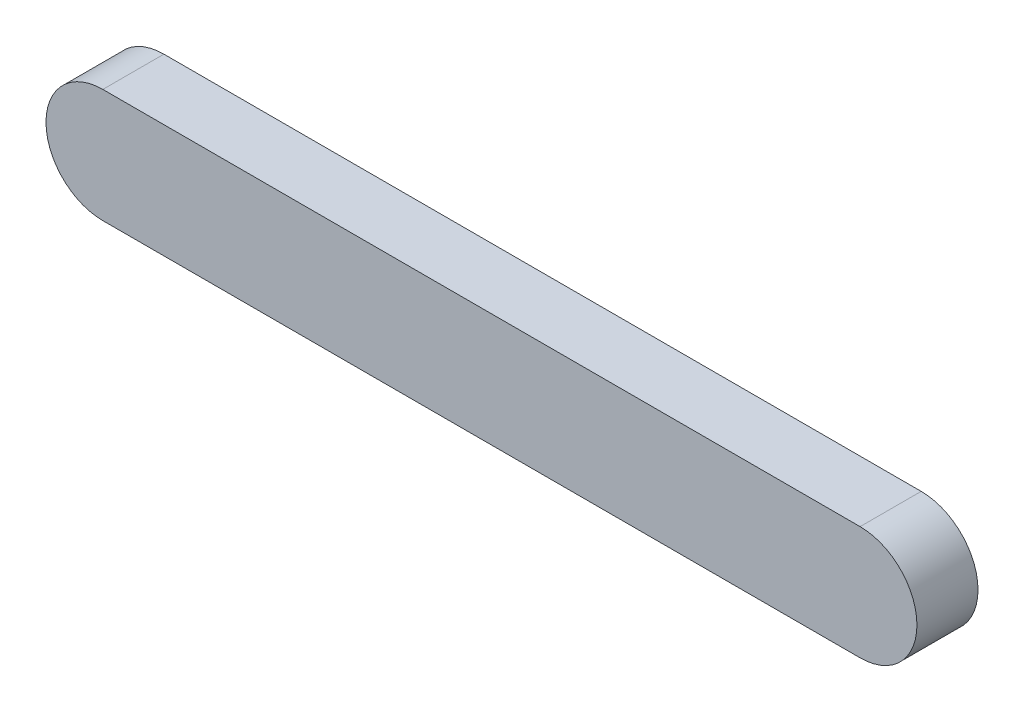
ISO-10303-21;
HEADER;
FILE_DESCRIPTION(('STEP AP214'),'2;1');
FILE_NAME('part.step','',(''),(''),'','','');
FILE_SCHEMA(('AUTOMOTIVE_DESIGN { 1 0 10303 214 1 1 1 1 }'));
ENDSEC;
DATA;
#1=APPLICATION_CONTEXT('core data for automotive mechanical design processes');
#2=APPLICATION_PROTOCOL_DEFINITION('international standard','automotive_design',2000,#1);
#3=PRODUCT_CONTEXT('',#1,'mechanical');
#4=PRODUCT('Part','Part','',(#3));
#5=PRODUCT_RELATED_PRODUCT_CATEGORY('part','',(#4));
#6=PRODUCT_DEFINITION_FORMATION('','',#4);
#7=PRODUCT_DEFINITION_CONTEXT('part definition',#1,'design');
#8=PRODUCT_DEFINITION('design','',#6,#7);
#9=PRODUCT_DEFINITION_SHAPE('','',#8);
#10=(LENGTH_UNIT() NAMED_UNIT(*) SI_UNIT(.MILLI.,.METRE.));
#11=(NAMED_UNIT(*) PLANE_ANGLE_UNIT() SI_UNIT($,.RADIAN.));
#12=(NAMED_UNIT(*) SI_UNIT($,.STERADIAN.) SOLID_ANGLE_UNIT());
#13=UNCERTAINTY_MEASURE_WITH_UNIT(LENGTH_MEASURE(1.E-05),#10,'distance_accuracy_value','');
#14=(GEOMETRIC_REPRESENTATION_CONTEXT(3) GLOBAL_UNCERTAINTY_ASSIGNED_CONTEXT((#13)) GLOBAL_UNIT_ASSIGNED_CONTEXT((#10,
#11,#12)) REPRESENTATION_CONTEXT('',''));
#15=CARTESIAN_POINT('',(0.,0.,0.));
#16=DIRECTION('',(0.,0.,1.));
#17=DIRECTION('',(1.,0.,0.));
#18=AXIS2_PLACEMENT_3D('',#15,#16,#17);
#19=CARTESIAN_POINT('',(69.4660631607421,0.,10.));
#20=DIRECTION('',(0.,0.,-1.));
#21=DIRECTION('',(-1.,0.,0.));
#22=AXIS2_PLACEMENT_3D('',#19,#20,#21);
#23=CYLINDRICAL_SURFACE('',#22,9.30539398447655);
#24=CARTESIAN_POINT('',(69.4660631607421,0.,0.));
#25=DIRECTION('',(0.,0.,1.));
#26=DIRECTION('',(1.,0.,0.));
#27=AXIS2_PLACEMENT_3D('',#24,#25,#26);
#28=CIRCLE('',#27,9.30539398447655);
#29=CARTESIAN_POINT('',(69.4660631607421,-9.30539398447656,0.));
#30=VERTEX_POINT('',#29);
#31=CARTESIAN_POINT('',(69.4660631607421,9.30539398447655,0.));
#32=VERTEX_POINT('',#31);
#33=EDGE_CURVE('E107',#30,#32,#28,.T.);
#34=ORIENTED_EDGE('',*,*,#33,.T.);
#35=DIRECTION('',(0.,0.,-1.));
#36=VECTOR('',#35,1.);
#37=CARTESIAN_POINT('',(69.4660631607421,9.30539398447655,10.));
#38=LINE('',#37,#36);
#39=CARTESIAN_POINT('',(69.4660631607421,9.30539398447655,10.));
#40=VERTEX_POINT('',#39);
#41=EDGE_CURVE('E11',#40,#32,#38,.T.);
#42=ORIENTED_EDGE('',*,*,#41,.F.);
#43=CARTESIAN_POINT('',(69.4660631607421,0.,10.));
#44=DIRECTION('',(0.,0.,1.));
#45=DIRECTION('',(1.,0.,0.));
#46=AXIS2_PLACEMENT_3D('',#43,#44,#45);
#47=CIRCLE('',#46,9.30539398447655);
#48=CARTESIAN_POINT('',(69.4660631607421,-9.30539398447656,10.));
#49=VERTEX_POINT('',#48);
#50=EDGE_CURVE('E91',#49,#40,#47,.T.);
#51=ORIENTED_EDGE('',*,*,#50,.F.);
#52=DIRECTION('',(0.,0.,-1.));
#53=VECTOR('',#52,1.);
#54=CARTESIAN_POINT('',(69.4660631607421,-9.30539398447656,10.));
#55=LINE('',#54,#53);
#56=EDGE_CURVE('E103',#49,#30,#55,.T.);
#57=ORIENTED_EDGE('',*,*,#56,.T.);
#58=EDGE_LOOP('',(#34,#42,#51,#57));
#59=FACE_BOUND('',#58,.T.);
#60=ADVANCED_FACE('F39',(#59),#23,.T.);
#61=CARTESIAN_POINT('',(69.4660631607421,9.30539398447655,10.));
#62=DIRECTION('',(0.,-1.,0.));
#63=DIRECTION('',(1.,0.,0.));
#64=AXIS2_PLACEMENT_3D('',#61,#62,#63);
#65=PLANE('',#64);
#66=DIRECTION('',(-1.,0.,0.));
#67=VECTOR('',#66,1.);
#68=CARTESIAN_POINT('',(69.4660631607421,9.30539398447655,0.));
#69=LINE('',#68,#67);
#70=CARTESIAN_POINT('',(-54.5339368392579,9.30539398447655,0.));
#71=VERTEX_POINT('',#70);
#72=EDGE_CURVE('E96',#32,#71,#69,.T.);
#73=ORIENTED_EDGE('',*,*,#72,.T.);
#74=DIRECTION('',(0.,0.,-1.));
#75=VECTOR('',#74,1.);
#76=CARTESIAN_POINT('',(-54.5339368392579,9.30539398447655,10.));
#77=LINE('',#76,#75);
#78=CARTESIAN_POINT('',(-54.5339368392579,9.30539398447655,10.));
#79=VERTEX_POINT('',#78);
#80=EDGE_CURVE('E48',#79,#71,#77,.T.);
#81=ORIENTED_EDGE('',*,*,#80,.F.);
#82=DIRECTION('',(-1.,0.,0.));
#83=VECTOR('',#82,1.);
#84=CARTESIAN_POINT('',(69.4660631607421,9.30539398447655,10.));
#85=LINE('',#84,#83);
#86=EDGE_CURVE('E86',#40,#79,#85,.T.);
#87=ORIENTED_EDGE('',*,*,#86,.F.);
#88=ORIENTED_EDGE('',*,*,#41,.T.);
#89=EDGE_LOOP('',(#73,#81,#87,#88));
#90=FACE_BOUND('',#89,.T.);
#91=ADVANCED_FACE('F95',(#90),#65,.F.);
#92=CARTESIAN_POINT('',(-54.5339368392579,0.,10.));
#93=DIRECTION('',(0.,0.,-1.));
#94=DIRECTION('',(-1.,0.,0.));
#95=AXIS2_PLACEMENT_3D('',#92,#93,#94);
#96=CYLINDRICAL_SURFACE('',#95,9.30539398447655);
#97=CARTESIAN_POINT('',(-54.5339368392579,0.,0.));
#98=DIRECTION('',(0.,0.,1.));
#99=DIRECTION('',(1.,0.,0.));
#100=AXIS2_PLACEMENT_3D('',#97,#98,#99);
#101=CIRCLE('',#100,9.30539398447655);
#102=CARTESIAN_POINT('',(-54.5339368392579,-9.30539398447655,0.));
#103=VERTEX_POINT('',#102);
#104=EDGE_CURVE('E73',#71,#103,#101,.T.);
#105=ORIENTED_EDGE('',*,*,#104,.T.);
#106=DIRECTION('',(0.,0.,-1.));
#107=VECTOR('',#106,1.);
#108=CARTESIAN_POINT('',(-54.5339368392579,-9.30539398447655,10.));
#109=LINE('',#108,#107);
#110=CARTESIAN_POINT('',(-54.5339368392579,-9.30539398447655,10.));
#111=VERTEX_POINT('',#110);
#112=EDGE_CURVE('E98',#111,#103,#109,.T.);
#113=ORIENTED_EDGE('',*,*,#112,.F.);
#114=CARTESIAN_POINT('',(-54.5339368392579,0.,10.));
#115=DIRECTION('',(0.,0.,1.));
#116=DIRECTION('',(1.,0.,0.));
#117=AXIS2_PLACEMENT_3D('',#114,#115,#116);
#118=CIRCLE('',#117,9.30539398447655);
#119=EDGE_CURVE('E89',#79,#111,#118,.T.);
#120=ORIENTED_EDGE('',*,*,#119,.F.);
#121=ORIENTED_EDGE('',*,*,#80,.T.);
#122=EDGE_LOOP('',(#105,#113,#120,#121));
#123=FACE_BOUND('',#122,.T.);
#124=ADVANCED_FACE('F99',(#123),#96,.T.);
#125=CARTESIAN_POINT('',(69.4660631607421,-9.30539398447656,10.));
#126=DIRECTION('',(0.,1.,0.));
#127=DIRECTION('',(-1.,0.,0.));
#128=AXIS2_PLACEMENT_3D('',#125,#126,#127);
#129=PLANE('',#128);
#130=DIRECTION('',(1.,0.,0.));
#131=VECTOR('',#130,1.);
#132=CARTESIAN_POINT('',(69.4660631607421,-9.30539398447656,0.));
#133=LINE('',#132,#131);
#134=EDGE_CURVE('E79',#103,#30,#133,.T.);
#135=ORIENTED_EDGE('',*,*,#134,.T.);
#136=ORIENTED_EDGE('',*,*,#56,.F.);
#137=DIRECTION('',(1.,0.,0.));
#138=VECTOR('',#137,1.);
#139=CARTESIAN_POINT('',(69.4660631607421,-9.30539398447656,10.));
#140=LINE('',#139,#138);
#141=EDGE_CURVE('E56',#111,#49,#140,.T.);
#142=ORIENTED_EDGE('',*,*,#141,.F.);
#143=ORIENTED_EDGE('',*,*,#112,.T.);
#144=EDGE_LOOP('',(#135,#136,#142,#143));
#145=FACE_BOUND('',#144,.T.);
#146=ADVANCED_FACE('F120',(#145),#129,.F.);
#147=CARTESIAN_POINT('',(69.4660631607421,0.,10.));
#148=DIRECTION('',(0.,0.,1.));
#149=DIRECTION('',(1.,0.,0.));
#150=AXIS2_PLACEMENT_3D('',#147,#148,#149);
#151=PLANE('',#150);
#152=ORIENTED_EDGE('',*,*,#50,.T.);
#153=ORIENTED_EDGE('',*,*,#86,.T.);
#154=ORIENTED_EDGE('',*,*,#119,.T.);
#155=ORIENTED_EDGE('',*,*,#141,.T.);
#156=EDGE_LOOP('',(#152,#153,#154,#155));
#157=FACE_BOUND('',#156,.T.);
#158=ADVANCED_FACE('F87',(#157),#151,.T.);
#159=CARTESIAN_POINT('',(69.4660631607421,0.,0.));
#160=DIRECTION('',(0.,0.,1.));
#161=DIRECTION('',(1.,0.,0.));
#162=AXIS2_PLACEMENT_3D('',#159,#160,#161);
#163=PLANE('',#162);
#164=ORIENTED_EDGE('',*,*,#33,.F.);
#165=ORIENTED_EDGE('',*,*,#134,.F.);
#166=ORIENTED_EDGE('',*,*,#104,.F.);
#167=ORIENTED_EDGE('',*,*,#72,.F.);
#168=EDGE_LOOP('',(#164,#165,#166,#167));
#169=FACE_BOUND('',#168,.T.);
#170=ADVANCED_FACE('F123',(#169),#163,.F.);
#171=CLOSED_SHELL('',(#60,#91,#124,#146,#158,#170));
#172=MANIFOLD_SOLID_BREP('B2',#171);
#173=ADVANCED_BREP_SHAPE_REPRESENTATION('',(#18,#172),#14);
#174=SHAPE_DEFINITION_REPRESENTATION(#9,#173);
ENDSEC;
END-ISO-10303-21;
